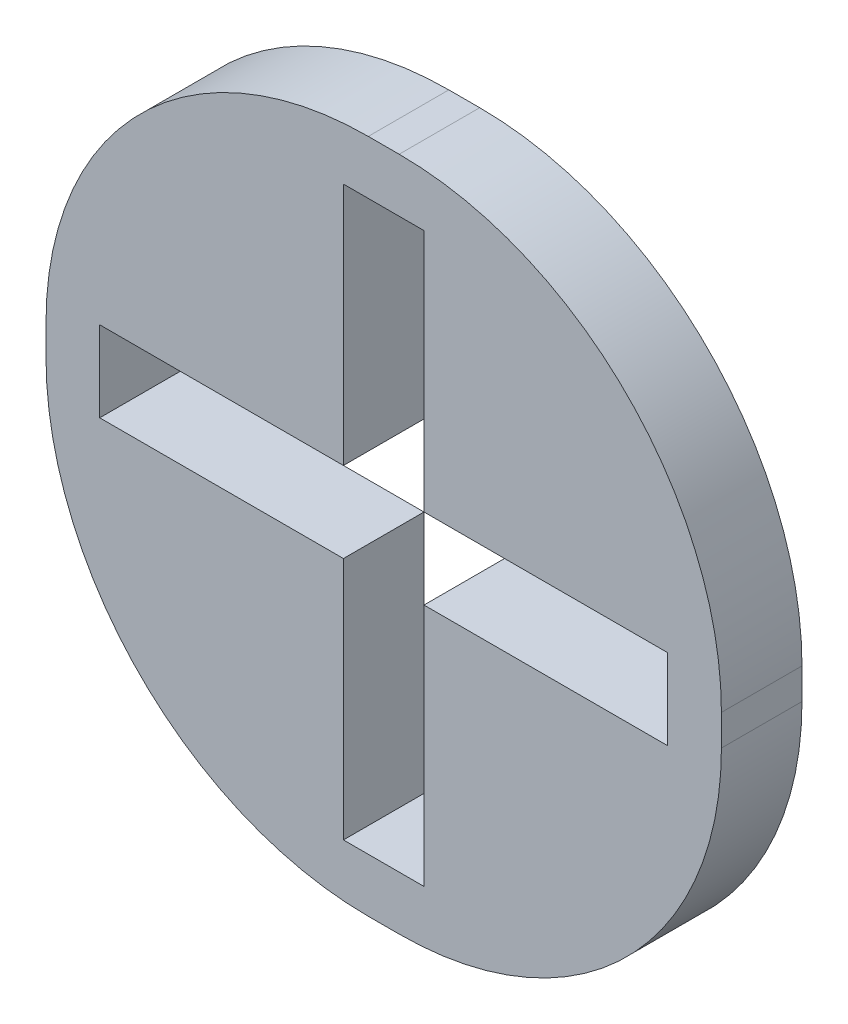
ISO-10303-21;
HEADER;
FILE_DESCRIPTION(('STEP AP214'),'2;1');
FILE_NAME('part.step','',(''),(''),'','','');
FILE_SCHEMA(('AUTOMOTIVE_DESIGN { 1 0 10303 214 1 1 1 1 }'));
ENDSEC;
DATA;
#1=APPLICATION_CONTEXT('core data for automotive mechanical design processes');
#2=APPLICATION_PROTOCOL_DEFINITION('international standard','automotive_design',2000,#1);
#3=PRODUCT_CONTEXT('',#1,'mechanical');
#4=PRODUCT('Part','Part','',(#3));
#5=PRODUCT_RELATED_PRODUCT_CATEGORY('part','',(#4));
#6=PRODUCT_DEFINITION_FORMATION('','',#4);
#7=PRODUCT_DEFINITION_CONTEXT('part definition',#1,'design');
#8=PRODUCT_DEFINITION('design','',#6,#7);
#9=PRODUCT_DEFINITION_SHAPE('','',#8);
#10=(LENGTH_UNIT() NAMED_UNIT(*) SI_UNIT(.MILLI.,.METRE.));
#11=(NAMED_UNIT(*) PLANE_ANGLE_UNIT() SI_UNIT($,.RADIAN.));
#12=(NAMED_UNIT(*) SI_UNIT($,.STERADIAN.) SOLID_ANGLE_UNIT());
#13=UNCERTAINTY_MEASURE_WITH_UNIT(LENGTH_MEASURE(1.E-05),#10,'distance_accuracy_value','');
#14=(GEOMETRIC_REPRESENTATION_CONTEXT(3) GLOBAL_UNCERTAINTY_ASSIGNED_CONTEXT((#13)) GLOBAL_UNIT_ASSIGNED_CONTEXT((#10,
#11,#12)) REPRESENTATION_CONTEXT('',''));
#15=CARTESIAN_POINT('',(0.,0.,0.));
#16=DIRECTION('',(0.,0.,1.));
#17=DIRECTION('',(1.,0.,0.));
#18=AXIS2_PLACEMENT_3D('',#15,#16,#17);
#19=CARTESIAN_POINT('',(0.,12.575,3.));
#20=DIRECTION('',(0.,-1.,0.));
#21=DIRECTION('',(0.,0.,-1.));
#22=AXIS2_PLACEMENT_3D('',#19,#20,#21);
#23=PLANE('',#22);
#24=DIRECTION('',(-1.,0.,0.));
#25=VECTOR('',#24,1.);
#26=CARTESIAN_POINT('',(0.,12.575,0.));
#27=LINE('',#26,#25);
#28=CARTESIAN_POINT('',(0.574999999999999,12.575,0.));
#29=VERTEX_POINT('',#28);
#30=CARTESIAN_POINT('',(-0.575000000000008,12.575,0.));
#31=VERTEX_POINT('',#30);
#32=EDGE_CURVE('E254',#29,#31,#27,.T.);
#33=ORIENTED_EDGE('',*,*,#32,.T.);
#34=DIRECTION('',(0.,0.,-1.));
#35=VECTOR('',#34,1.);
#36=CARTESIAN_POINT('',(-0.575000000000008,12.575,3.));
#37=LINE('',#36,#35);
#38=CARTESIAN_POINT('',(-0.575000000000008,12.575,3.));
#39=VERTEX_POINT('',#38);
#40=EDGE_CURVE('E11',#39,#31,#37,.T.);
#41=ORIENTED_EDGE('',*,*,#40,.F.);
#42=DIRECTION('',(-1.,0.,0.));
#43=VECTOR('',#42,1.);
#44=CARTESIAN_POINT('',(0.,12.575,3.));
#45=LINE('',#44,#43);
#46=CARTESIAN_POINT('',(0.574999999999999,12.575,3.));
#47=VERTEX_POINT('',#46);
#48=EDGE_CURVE('E405',#47,#39,#45,.T.);
#49=ORIENTED_EDGE('',*,*,#48,.F.);
#50=DIRECTION('',(0.,0.,-1.));
#51=VECTOR('',#50,1.);
#52=CARTESIAN_POINT('',(0.574999999999999,12.575,3.));
#53=LINE('',#52,#51);
#54=EDGE_CURVE('E281',#47,#29,#53,.T.);
#55=ORIENTED_EDGE('',*,*,#54,.T.);
#56=EDGE_LOOP('',(#33,#41,#49,#55));
#57=FACE_BOUND('',#56,.T.);
#58=ADVANCED_FACE('F45',(#57),#23,.F.);
#59=CARTESIAN_POINT('',(-0.575000000000004,0.575000000000001,3.));
#60=DIRECTION('',(0.,0.,-1.));
#61=DIRECTION('',(-1.,0.,0.));
#62=AXIS2_PLACEMENT_3D('',#59,#60,#61);
#63=CYLINDRICAL_SURFACE('',#62,12.);
#64=CARTESIAN_POINT('',(-0.575000000000004,0.575000000000001,0.));
#65=DIRECTION('',(0.,0.,1.));
#66=DIRECTION('',(1.,0.,0.));
#67=AXIS2_PLACEMENT_3D('',#64,#65,#66);
#68=CIRCLE('',#67,12.);
#69=CARTESIAN_POINT('',(-12.575,0.574999999999998,0.));
#70=VERTEX_POINT('',#69);
#71=EDGE_CURVE('E258',#31,#70,#68,.T.);
#72=ORIENTED_EDGE('',*,*,#71,.T.);
#73=DIRECTION('',(0.,0.,-1.));
#74=VECTOR('',#73,1.);
#75=CARTESIAN_POINT('',(-12.575,0.574999999999998,3.));
#76=LINE('',#75,#74);
#77=CARTESIAN_POINT('',(-12.575,0.574999999999998,3.));
#78=VERTEX_POINT('',#77);
#79=EDGE_CURVE('E56',#78,#70,#76,.T.);
#80=ORIENTED_EDGE('',*,*,#79,.F.);
#81=CARTESIAN_POINT('',(-0.575000000000004,0.575000000000001,3.));
#82=DIRECTION('',(0.,0.,1.));
#83=DIRECTION('',(1.,0.,0.));
#84=AXIS2_PLACEMENT_3D('',#81,#82,#83);
#85=CIRCLE('',#84,12.);
#86=EDGE_CURVE('E408',#39,#78,#85,.T.);
#87=ORIENTED_EDGE('',*,*,#86,.F.);
#88=ORIENTED_EDGE('',*,*,#40,.T.);
#89=EDGE_LOOP('',(#72,#80,#87,#88));
#90=FACE_BOUND('',#89,.T.);
#91=ADVANCED_FACE('F440',(#90),#63,.T.);
#92=CARTESIAN_POINT('',(-12.575,0.,3.));
#93=DIRECTION('',(-1.,0.,0.));
#94=DIRECTION('',(0.,0.,1.));
#95=AXIS2_PLACEMENT_3D('',#92,#93,#94);
#96=PLANE('',#95);
#97=DIRECTION('',(0.,1.,0.));
#98=VECTOR('',#97,1.);
#99=CARTESIAN_POINT('',(-12.575,0.,0.));
#100=LINE('',#99,#98);
#101=CARTESIAN_POINT('',(-12.575,-0.575000000000002,0.));
#102=VERTEX_POINT('',#101);
#103=EDGE_CURVE('E262',#102,#70,#100,.T.);
#104=ORIENTED_EDGE('',*,*,#103,.F.);
#105=DIRECTION('',(0.,0.,-1.));
#106=VECTOR('',#105,1.);
#107=CARTESIAN_POINT('',(-12.575,-0.575000000000002,3.));
#108=LINE('',#107,#106);
#109=CARTESIAN_POINT('',(-12.575,-0.575000000000002,3.));
#110=VERTEX_POINT('',#109);
#111=EDGE_CURVE('E291',#110,#102,#108,.T.);
#112=ORIENTED_EDGE('',*,*,#111,.F.);
#113=DIRECTION('',(0.,1.,0.));
#114=VECTOR('',#113,1.);
#115=CARTESIAN_POINT('',(-12.575,0.,3.));
#116=LINE('',#115,#114);
#117=EDGE_CURVE('E411',#110,#78,#116,.T.);
#118=ORIENTED_EDGE('',*,*,#117,.T.);
#119=ORIENTED_EDGE('',*,*,#79,.T.);
#120=EDGE_LOOP('',(#104,#112,#118,#119));
#121=FACE_BOUND('',#120,.T.);
#122=ADVANCED_FACE('F445',(#121),#96,.T.);
#123=CARTESIAN_POINT('',(-0.575000000000004,-0.574999999999999,3.));
#124=DIRECTION('',(0.,0.,-1.));
#125=DIRECTION('',(-1.,0.,0.));
#126=AXIS2_PLACEMENT_3D('',#123,#124,#125);
#127=CYLINDRICAL_SURFACE('',#126,12.);
#128=CARTESIAN_POINT('',(-0.575000000000004,-0.574999999999999,0.));
#129=DIRECTION('',(0.,0.,1.));
#130=DIRECTION('',(1.,0.,0.));
#131=AXIS2_PLACEMENT_3D('',#128,#129,#130);
#132=CIRCLE('',#131,12.);
#133=CARTESIAN_POINT('',(-0.574999999999999,-12.575,0.));
#134=VERTEX_POINT('',#133);
#135=EDGE_CURVE('E266',#134,#102,#132,.F.);
#136=ORIENTED_EDGE('',*,*,#135,.F.);
#137=DIRECTION('',(0.,0.,-1.));
#138=VECTOR('',#137,1.);
#139=CARTESIAN_POINT('',(-0.574999999999999,-12.575,3.));
#140=LINE('',#139,#138);
#141=CARTESIAN_POINT('',(-0.574999999999999,-12.575,3.));
#142=VERTEX_POINT('',#141);
#143=EDGE_CURVE('E288',#142,#134,#140,.T.);
#144=ORIENTED_EDGE('',*,*,#143,.F.);
#145=CARTESIAN_POINT('',(-0.575000000000004,-0.574999999999999,3.));
#146=DIRECTION('',(0.,0.,1.));
#147=DIRECTION('',(1.,0.,0.));
#148=AXIS2_PLACEMENT_3D('',#145,#146,#147);
#149=CIRCLE('',#148,12.);
#150=EDGE_CURVE('E415',#142,#110,#149,.F.);
#151=ORIENTED_EDGE('',*,*,#150,.T.);
#152=ORIENTED_EDGE('',*,*,#111,.T.);
#153=EDGE_LOOP('',(#136,#144,#151,#152));
#154=FACE_BOUND('',#153,.T.);
#155=ADVANCED_FACE('F608',(#154),#127,.T.);
#156=CARTESIAN_POINT('',(0.,-12.575,3.));
#157=DIRECTION('',(0.,-1.,0.));
#158=DIRECTION('',(0.,0.,-1.));
#159=AXIS2_PLACEMENT_3D('',#156,#157,#158);
#160=PLANE('',#159);
#161=DIRECTION('',(-1.,0.,0.));
#162=VECTOR('',#161,1.);
#163=CARTESIAN_POINT('',(0.,-12.575,0.));
#164=LINE('',#163,#162);
#165=CARTESIAN_POINT('',(0.574999999999999,-12.575,0.));
#166=VERTEX_POINT('',#165);
#167=EDGE_CURVE('E270',#166,#134,#164,.T.);
#168=ORIENTED_EDGE('',*,*,#167,.F.);
#169=DIRECTION('',(0.,0.,-1.));
#170=VECTOR('',#169,1.);
#171=CARTESIAN_POINT('',(0.574999999999999,-12.575,3.));
#172=LINE('',#171,#170);
#173=CARTESIAN_POINT('',(0.574999999999999,-12.575,3.));
#174=VERTEX_POINT('',#173);
#175=EDGE_CURVE('E212',#174,#166,#172,.T.);
#176=ORIENTED_EDGE('',*,*,#175,.F.);
#177=DIRECTION('',(-1.,0.,0.));
#178=VECTOR('',#177,1.);
#179=CARTESIAN_POINT('',(0.,-12.575,3.));
#180=LINE('',#179,#178);
#181=EDGE_CURVE('E203',#174,#142,#180,.T.);
#182=ORIENTED_EDGE('',*,*,#181,.T.);
#183=ORIENTED_EDGE('',*,*,#143,.T.);
#184=EDGE_LOOP('',(#168,#176,#182,#183));
#185=FACE_BOUND('',#184,.T.);
#186=ADVANCED_FACE('F421',(#185),#160,.T.);
#187=CARTESIAN_POINT('',(0.574999999999999,-0.574999999999999,3.));
#188=DIRECTION('',(0.,0.,-1.));
#189=DIRECTION('',(-1.,0.,0.));
#190=AXIS2_PLACEMENT_3D('',#187,#188,#189);
#191=CYLINDRICAL_SURFACE('',#190,12.);
#192=CARTESIAN_POINT('',(0.574999999999999,-0.574999999999999,0.));
#193=DIRECTION('',(0.,0.,1.));
#194=DIRECTION('',(1.,0.,0.));
#195=AXIS2_PLACEMENT_3D('',#192,#193,#194);
#196=CIRCLE('',#195,12.);
#197=CARTESIAN_POINT('',(12.575,-0.574999999999998,0.));
#198=VERTEX_POINT('',#197);
#199=EDGE_CURVE('E210',#166,#198,#196,.T.);
#200=ORIENTED_EDGE('',*,*,#199,.T.);
#201=DIRECTION('',(0.,0.,-1.));
#202=VECTOR('',#201,1.);
#203=CARTESIAN_POINT('',(12.575,-0.574999999999998,3.));
#204=LINE('',#203,#202);
#205=CARTESIAN_POINT('',(12.575,-0.574999999999998,3.));
#206=VERTEX_POINT('',#205);
#207=EDGE_CURVE('E207',#206,#198,#204,.T.);
#208=ORIENTED_EDGE('',*,*,#207,.F.);
#209=CARTESIAN_POINT('',(0.574999999999999,-0.574999999999999,3.));
#210=DIRECTION('',(0.,0.,1.));
#211=DIRECTION('',(1.,0.,0.));
#212=AXIS2_PLACEMENT_3D('',#209,#210,#211);
#213=CIRCLE('',#212,12.);
#214=EDGE_CURVE('E196',#174,#206,#213,.T.);
#215=ORIENTED_EDGE('',*,*,#214,.F.);
#216=ORIENTED_EDGE('',*,*,#175,.T.);
#217=EDGE_LOOP('',(#200,#208,#215,#216));
#218=FACE_BOUND('',#217,.T.);
#219=ADVANCED_FACE('F208',(#218),#191,.T.);
#220=CARTESIAN_POINT('',(12.575,0.,3.));
#221=DIRECTION('',(-1.,0.,0.));
#222=DIRECTION('',(0.,0.,1.));
#223=AXIS2_PLACEMENT_3D('',#220,#221,#222);
#224=PLANE('',#223);
#225=DIRECTION('',(0.,1.,0.));
#226=VECTOR('',#225,1.);
#227=CARTESIAN_POINT('',(12.575,0.,0.));
#228=LINE('',#227,#226);
#229=CARTESIAN_POINT('',(12.575,0.575000000000002,0.));
#230=VERTEX_POINT('',#229);
#231=EDGE_CURVE('E130',#198,#230,#228,.T.);
#232=ORIENTED_EDGE('',*,*,#231,.T.);
#233=DIRECTION('',(0.,0.,-1.));
#234=VECTOR('',#233,1.);
#235=CARTESIAN_POINT('',(12.575,0.575000000000002,3.));
#236=LINE('',#235,#234);
#237=CARTESIAN_POINT('',(12.575,0.575000000000002,3.));
#238=VERTEX_POINT('',#237);
#239=EDGE_CURVE('E213',#238,#230,#236,.T.);
#240=ORIENTED_EDGE('',*,*,#239,.F.);
#241=DIRECTION('',(0.,1.,0.));
#242=VECTOR('',#241,1.);
#243=CARTESIAN_POINT('',(12.575,0.,3.));
#244=LINE('',#243,#242);
#245=EDGE_CURVE('E200',#206,#238,#244,.T.);
#246=ORIENTED_EDGE('',*,*,#245,.F.);
#247=ORIENTED_EDGE('',*,*,#207,.T.);
#248=EDGE_LOOP('',(#232,#240,#246,#247));
#249=FACE_BOUND('',#248,.T.);
#250=ADVANCED_FACE('F215',(#249),#224,.F.);
#251=CARTESIAN_POINT('',(0.,10.575,3.));
#252=DIRECTION('',(0.,1.,0.));
#253=DIRECTION('',(0.,0.,1.));
#254=AXIS2_PLACEMENT_3D('',#251,#252,#253);
#255=PLANE('',#254);
#256=DIRECTION('',(1.,0.,0.));
#257=VECTOR('',#256,1.);
#258=CARTESIAN_POINT('',(0.,10.575,0.));
#259=LINE('',#258,#257);
#260=CARTESIAN_POINT('',(-1.5,10.575,0.));
#261=VERTEX_POINT('',#260);
#262=CARTESIAN_POINT('',(1.5,10.575,0.));
#263=VERTEX_POINT('',#262);
#264=EDGE_CURVE('E223',#261,#263,#259,.T.);
#265=ORIENTED_EDGE('',*,*,#264,.T.);
#266=DIRECTION('',(0.,0.,-1.));
#267=VECTOR('',#266,1.);
#268=CARTESIAN_POINT('',(1.5,10.575,3.));
#269=LINE('',#268,#267);
#270=CARTESIAN_POINT('',(1.5,10.575,3.));
#271=VERTEX_POINT('',#270);
#272=EDGE_CURVE('E49',#271,#263,#269,.T.);
#273=ORIENTED_EDGE('',*,*,#272,.F.);
#274=DIRECTION('',(1.,0.,0.));
#275=VECTOR('',#274,1.);
#276=CARTESIAN_POINT('',(0.,10.575,3.));
#277=LINE('',#276,#275);
#278=CARTESIAN_POINT('',(-1.5,10.575,3.));
#279=VERTEX_POINT('',#278);
#280=EDGE_CURVE('E280',#279,#271,#277,.T.);
#281=ORIENTED_EDGE('',*,*,#280,.F.);
#282=DIRECTION('',(0.,0.,-1.));
#283=VECTOR('',#282,1.);
#284=CARTESIAN_POINT('',(-1.5,10.575,3.));
#285=LINE('',#284,#283);
#286=EDGE_CURVE('E219',#279,#261,#285,.T.);
#287=ORIENTED_EDGE('',*,*,#286,.T.);
#288=EDGE_LOOP('',(#265,#273,#281,#287));
#289=FACE_BOUND('',#288,.T.);
#290=ADVANCED_FACE('F47',(#289),#255,.F.);
#291=CARTESIAN_POINT('',(1.5,0.,3.));
#292=DIRECTION('',(1.,0.,0.));
#293=DIRECTION('',(0.,0.,-1.));
#294=AXIS2_PLACEMENT_3D('',#291,#292,#293);
#295=PLANE('',#294);
#296=DIRECTION('',(0.,-1.,0.));
#297=VECTOR('',#296,1.);
#298=CARTESIAN_POINT('',(1.5,0.,0.));
#299=LINE('',#298,#297);
#300=CARTESIAN_POINT('',(1.5,1.5,0.));
#301=VERTEX_POINT('',#300);
#302=EDGE_CURVE('E227',#263,#301,#299,.T.);
#303=ORIENTED_EDGE('',*,*,#302,.T.);
#304=DIRECTION('',(0.,0.,-1.));
#305=VECTOR('',#304,1.);
#306=CARTESIAN_POINT('',(1.5,1.5,3.));
#307=LINE('',#306,#305);
#308=CARTESIAN_POINT('',(1.5,1.5,3.));
#309=VERTEX_POINT('',#308);
#310=EDGE_CURVE('E329',#309,#301,#307,.T.);
#311=ORIENTED_EDGE('',*,*,#310,.F.);
#312=DIRECTION('',(0.,-1.,0.));
#313=VECTOR('',#312,1.);
#314=CARTESIAN_POINT('',(1.5,0.,3.));
#315=LINE('',#314,#313);
#316=EDGE_CURVE('E145',#271,#309,#315,.T.);
#317=ORIENTED_EDGE('',*,*,#316,.F.);
#318=ORIENTED_EDGE('',*,*,#272,.T.);
#319=EDGE_LOOP('',(#303,#311,#317,#318));
#320=FACE_BOUND('',#319,.T.);
#321=ADVANCED_FACE('F337',(#320),#295,.F.);
#322=CARTESIAN_POINT('',(0.,1.5,3.));
#323=DIRECTION('',(0.,1.,0.));
#324=DIRECTION('',(0.,0.,1.));
#325=AXIS2_PLACEMENT_3D('',#322,#323,#324);
#326=PLANE('',#325);
#327=DIRECTION('',(1.,0.,0.));
#328=VECTOR('',#327,1.);
#329=CARTESIAN_POINT('',(0.,1.5,0.));
#330=LINE('',#329,#328);
#331=CARTESIAN_POINT('',(10.575,1.5,0.));
#332=VERTEX_POINT('',#331);
#333=EDGE_CURVE('E230',#301,#332,#330,.T.);
#334=ORIENTED_EDGE('',*,*,#333,.T.);
#335=DIRECTION('',(0.,0.,-1.));
#336=VECTOR('',#335,1.);
#337=CARTESIAN_POINT('',(10.575,1.5,3.));
#338=LINE('',#337,#336);
#339=CARTESIAN_POINT('',(10.575,1.5,3.));
#340=VERTEX_POINT('',#339);
#341=EDGE_CURVE('E326',#340,#332,#338,.T.);
#342=ORIENTED_EDGE('',*,*,#341,.F.);
#343=DIRECTION('',(1.,0.,0.));
#344=VECTOR('',#343,1.);
#345=CARTESIAN_POINT('',(0.,1.5,3.));
#346=LINE('',#345,#344);
#347=EDGE_CURVE('E477',#309,#340,#346,.T.);
#348=ORIENTED_EDGE('',*,*,#347,.F.);
#349=ORIENTED_EDGE('',*,*,#310,.T.);
#350=EDGE_LOOP('',(#334,#342,#348,#349));
#351=FACE_BOUND('',#350,.T.);
#352=ADVANCED_FACE('F452',(#351),#326,.F.);
#353=CARTESIAN_POINT('',(10.575,0.,3.));
#354=DIRECTION('',(1.,0.,0.));
#355=DIRECTION('',(0.,1.,0.));
#356=AXIS2_PLACEMENT_3D('',#353,#354,#355);
#357=PLANE('',#356);
#358=DIRECTION('',(0.,-1.,0.));
#359=VECTOR('',#358,1.);
#360=CARTESIAN_POINT('',(10.575,0.,0.));
#361=LINE('',#360,#359);
#362=CARTESIAN_POINT('',(10.575,-1.5,0.));
#363=VERTEX_POINT('',#362);
#364=EDGE_CURVE('E234',#332,#363,#361,.T.);
#365=ORIENTED_EDGE('',*,*,#364,.T.);
#366=DIRECTION('',(0.,0.,-1.));
#367=VECTOR('',#366,1.);
#368=CARTESIAN_POINT('',(10.575,-1.5,3.));
#369=LINE('',#368,#367);
#370=CARTESIAN_POINT('',(10.575,-1.5,3.));
#371=VERTEX_POINT('',#370);
#372=EDGE_CURVE('E322',#371,#363,#369,.T.);
#373=ORIENTED_EDGE('',*,*,#372,.F.);
#374=DIRECTION('',(0.,-1.,0.));
#375=VECTOR('',#374,1.);
#376=CARTESIAN_POINT('',(10.575,0.,3.));
#377=LINE('',#376,#375);
#378=EDGE_CURVE('E475',#340,#371,#377,.T.);
#379=ORIENTED_EDGE('',*,*,#378,.F.);
#380=ORIENTED_EDGE('',*,*,#341,.T.);
#381=EDGE_LOOP('',(#365,#373,#379,#380));
#382=FACE_BOUND('',#381,.T.);
#383=ADVANCED_FACE('F461',(#382),#357,.F.);
#384=CARTESIAN_POINT('',(0.,-1.5,3.));
#385=DIRECTION('',(0.,-1.,0.));
#386=DIRECTION('',(0.,0.,-1.));
#387=AXIS2_PLACEMENT_3D('',#384,#385,#386);
#388=PLANE('',#387);
#389=DIRECTION('',(-1.,0.,0.));
#390=VECTOR('',#389,1.);
#391=CARTESIAN_POINT('',(0.,-1.5,0.));
#392=LINE('',#391,#390);
#393=CARTESIAN_POINT('',(1.5,-1.5,0.));
#394=VERTEX_POINT('',#393);
#395=EDGE_CURVE('E238',#363,#394,#392,.T.);
#396=ORIENTED_EDGE('',*,*,#395,.T.);
#397=DIRECTION('',(0.,0.,-1.));
#398=VECTOR('',#397,1.);
#399=CARTESIAN_POINT('',(1.5,-1.5,3.));
#400=LINE('',#399,#398);
#401=CARTESIAN_POINT('',(1.5,-1.5,3.));
#402=VERTEX_POINT('',#401);
#403=EDGE_CURVE('E318',#402,#394,#400,.T.);
#404=ORIENTED_EDGE('',*,*,#403,.F.);
#405=DIRECTION('',(-1.,0.,0.));
#406=VECTOR('',#405,1.);
#407=CARTESIAN_POINT('',(0.,-1.5,3.));
#408=LINE('',#407,#406);
#409=EDGE_CURVE('E397',#371,#402,#408,.T.);
#410=ORIENTED_EDGE('',*,*,#409,.F.);
#411=ORIENTED_EDGE('',*,*,#372,.T.);
#412=EDGE_LOOP('',(#396,#404,#410,#411));
#413=FACE_BOUND('',#412,.T.);
#414=ADVANCED_FACE('F457',(#413),#388,.F.);
#415=CARTESIAN_POINT('',(1.5,-10.575,0.));
#416=VERTEX_POINT('',#415);
#417=EDGE_CURVE('E231',#394,#416,#299,.T.);
#418=ORIENTED_EDGE('',*,*,#417,.T.);
#419=DIRECTION('',(0.,0.,-1.));
#420=VECTOR('',#419,1.);
#421=CARTESIAN_POINT('',(1.5,-10.575,3.));
#422=LINE('',#421,#420);
#423=CARTESIAN_POINT('',(1.5,-10.575,3.));
#424=VERTEX_POINT('',#423);
#425=EDGE_CURVE('E315',#424,#416,#422,.T.);
#426=ORIENTED_EDGE('',*,*,#425,.F.);
#427=EDGE_CURVE('E391',#402,#424,#315,.T.);
#428=ORIENTED_EDGE('',*,*,#427,.F.);
#429=ORIENTED_EDGE('',*,*,#403,.T.);
#430=EDGE_LOOP('',(#418,#426,#428,#429));
#431=FACE_BOUND('',#430,.T.);
#432=ADVANCED_FACE('F377',(#431),#295,.F.);
#433=CARTESIAN_POINT('',(0.,-10.575,3.));
#434=DIRECTION('',(0.,1.,0.));
#435=DIRECTION('',(0.,0.,1.));
#436=AXIS2_PLACEMENT_3D('',#433,#434,#435);
#437=PLANE('',#436);
#438=DIRECTION('',(1.,0.,0.));
#439=VECTOR('',#438,1.);
#440=CARTESIAN_POINT('',(0.,-10.575,0.));
#441=LINE('',#440,#439);
#442=CARTESIAN_POINT('',(-1.5,-10.575,0.));
#443=VERTEX_POINT('',#442);
#444=EDGE_CURVE('E242',#443,#416,#441,.T.);
#445=ORIENTED_EDGE('',*,*,#444,.F.);
#446=DIRECTION('',(0.,0.,-1.));
#447=VECTOR('',#446,1.);
#448=CARTESIAN_POINT('',(-1.5,-10.575,3.));
#449=LINE('',#448,#447);
#450=CARTESIAN_POINT('',(-1.5,-10.575,3.));
#451=VERTEX_POINT('',#450);
#452=EDGE_CURVE('E312',#451,#443,#449,.T.);
#453=ORIENTED_EDGE('',*,*,#452,.F.);
#454=DIRECTION('',(1.,0.,0.));
#455=VECTOR('',#454,1.);
#456=CARTESIAN_POINT('',(0.,-10.575,3.));
#457=LINE('',#456,#455);
#458=EDGE_CURVE('E386',#451,#424,#457,.T.);
#459=ORIENTED_EDGE('',*,*,#458,.T.);
#460=ORIENTED_EDGE('',*,*,#425,.T.);
#461=EDGE_LOOP('',(#445,#453,#459,#460));
#462=FACE_BOUND('',#461,.T.);
#463=ADVANCED_FACE('F384',(#462),#437,.T.);
#464=CARTESIAN_POINT('',(-1.5,0.,3.));
#465=DIRECTION('',(1.,0.,0.));
#466=DIRECTION('',(0.,0.,-1.));
#467=AXIS2_PLACEMENT_3D('',#464,#465,#466);
#468=PLANE('',#467);
#469=DIRECTION('',(0.,-1.,0.));
#470=VECTOR('',#469,1.);
#471=CARTESIAN_POINT('',(-1.5,0.,0.));
#472=LINE('',#471,#470);
#473=CARTESIAN_POINT('',(-1.5,-1.5,0.));
#474=VERTEX_POINT('',#473);
#475=EDGE_CURVE('E246',#474,#443,#472,.T.);
#476=ORIENTED_EDGE('',*,*,#475,.F.);
#477=DIRECTION('',(0.,0.,-1.));
#478=VECTOR('',#477,1.);
#479=CARTESIAN_POINT('',(-1.5,-1.5,3.));
#480=LINE('',#479,#478);
#481=CARTESIAN_POINT('',(-1.5,-1.5,3.));
#482=VERTEX_POINT('',#481);
#483=EDGE_CURVE('E309',#482,#474,#480,.T.);
#484=ORIENTED_EDGE('',*,*,#483,.F.);
#485=DIRECTION('',(0.,-1.,0.));
#486=VECTOR('',#485,1.);
#487=CARTESIAN_POINT('',(-1.5,0.,3.));
#488=LINE('',#487,#486);
#489=EDGE_CURVE('E390',#482,#451,#488,.T.);
#490=ORIENTED_EDGE('',*,*,#489,.T.);
#491=ORIENTED_EDGE('',*,*,#452,.T.);
#492=EDGE_LOOP('',(#476,#484,#490,#491));
#493=FACE_BOUND('',#492,.T.);
#494=ADVANCED_FACE('F436',(#493),#468,.T.);
#495=CARTESIAN_POINT('',(-10.575,-1.5,0.));
#496=VERTEX_POINT('',#495);
#497=EDGE_CURVE('E241',#474,#496,#392,.T.);
#498=ORIENTED_EDGE('',*,*,#497,.T.);
#499=DIRECTION('',(0.,0.,-1.));
#500=VECTOR('',#499,1.);
#501=CARTESIAN_POINT('',(-10.575,-1.5,3.));
#502=LINE('',#501,#500);
#503=CARTESIAN_POINT('',(-10.575,-1.5,3.));
#504=VERTEX_POINT('',#503);
#505=EDGE_CURVE('E305',#504,#496,#502,.T.);
#506=ORIENTED_EDGE('',*,*,#505,.F.);
#507=EDGE_CURVE('E369',#482,#504,#408,.T.);
#508=ORIENTED_EDGE('',*,*,#507,.F.);
#509=ORIENTED_EDGE('',*,*,#483,.T.);
#510=EDGE_LOOP('',(#498,#506,#508,#509));
#511=FACE_BOUND('',#510,.T.);
#512=ADVANCED_FACE('F368',(#511),#388,.F.);
#513=CARTESIAN_POINT('',(-10.575,0.,3.));
#514=DIRECTION('',(-1.,0.,0.));
#515=DIRECTION('',(0.,-1.,0.));
#516=AXIS2_PLACEMENT_3D('',#513,#514,#515);
#517=PLANE('',#516);
#518=DIRECTION('',(0.,1.,0.));
#519=VECTOR('',#518,1.);
#520=CARTESIAN_POINT('',(-10.575,0.,0.));
#521=LINE('',#520,#519);
#522=CARTESIAN_POINT('',(-10.575,1.5,0.));
#523=VERTEX_POINT('',#522);
#524=EDGE_CURVE('E251',#496,#523,#521,.T.);
#525=ORIENTED_EDGE('',*,*,#524,.T.);
#526=DIRECTION('',(0.,0.,-1.));
#527=VECTOR('',#526,1.);
#528=CARTESIAN_POINT('',(-10.575,1.5,3.));
#529=LINE('',#528,#527);
#530=CARTESIAN_POINT('',(-10.575,1.5,3.));
#531=VERTEX_POINT('',#530);
#532=EDGE_CURVE('E301',#531,#523,#529,.T.);
#533=ORIENTED_EDGE('',*,*,#532,.F.);
#534=DIRECTION('',(0.,1.,0.));
#535=VECTOR('',#534,1.);
#536=CARTESIAN_POINT('',(-10.575,0.,3.));
#537=LINE('',#536,#535);
#538=EDGE_CURVE('E365',#504,#531,#537,.T.);
#539=ORIENTED_EDGE('',*,*,#538,.F.);
#540=ORIENTED_EDGE('',*,*,#505,.T.);
#541=EDGE_LOOP('',(#525,#533,#539,#540));
#542=FACE_BOUND('',#541,.T.);
#543=ADVANCED_FACE('F362',(#542),#517,.F.);
#544=CARTESIAN_POINT('',(-1.5,1.5,0.));
#545=VERTEX_POINT('',#544);
#546=EDGE_CURVE('E235',#523,#545,#330,.T.);
#547=ORIENTED_EDGE('',*,*,#546,.T.);
#548=DIRECTION('',(0.,0.,-1.));
#549=VECTOR('',#548,1.);
#550=CARTESIAN_POINT('',(-1.5,1.5,3.));
#551=LINE('',#550,#549);
#552=CARTESIAN_POINT('',(-1.5,1.5,3.));
#553=VERTEX_POINT('',#552);
#554=EDGE_CURVE('E298',#553,#545,#551,.T.);
#555=ORIENTED_EDGE('',*,*,#554,.F.);
#556=EDGE_CURVE('E404',#531,#553,#346,.T.);
#557=ORIENTED_EDGE('',*,*,#556,.F.);
#558=ORIENTED_EDGE('',*,*,#532,.T.);
#559=EDGE_LOOP('',(#547,#555,#557,#558));
#560=FACE_BOUND('',#559,.T.);
#561=ADVANCED_FACE('F355',(#560),#326,.F.);
#562=EDGE_CURVE('E250',#261,#545,#472,.T.);
#563=ORIENTED_EDGE('',*,*,#562,.F.);
#564=ORIENTED_EDGE('',*,*,#286,.F.);
#565=EDGE_CURVE('E396',#279,#553,#488,.T.);
#566=ORIENTED_EDGE('',*,*,#565,.T.);
#567=ORIENTED_EDGE('',*,*,#554,.T.);
#568=EDGE_LOOP('',(#563,#564,#566,#567));
#569=FACE_BOUND('',#568,.T.);
#570=ADVANCED_FACE('F348',(#569),#468,.T.);
#571=CARTESIAN_POINT('',(0.574999999999999,0.575000000000001,3.));
#572=DIRECTION('',(0.,0.,-1.));
#573=DIRECTION('',(-1.,0.,0.));
#574=AXIS2_PLACEMENT_3D('',#571,#572,#573);
#575=CYLINDRICAL_SURFACE('',#574,12.);
#576=CARTESIAN_POINT('',(0.574999999999999,0.575000000000001,0.));
#577=DIRECTION('',(0.,0.,1.));
#578=DIRECTION('',(1.,0.,0.));
#579=AXIS2_PLACEMENT_3D('',#576,#577,#578);
#580=CIRCLE('',#579,12.);
#581=EDGE_CURVE('E136',#230,#29,#580,.T.);
#582=ORIENTED_EDGE('',*,*,#581,.T.);
#583=ORIENTED_EDGE('',*,*,#54,.F.);
#584=CARTESIAN_POINT('',(0.574999999999999,0.575000000000001,3.));
#585=DIRECTION('',(0.,0.,1.));
#586=DIRECTION('',(1.,0.,0.));
#587=AXIS2_PLACEMENT_3D('',#584,#585,#586);
#588=CIRCLE('',#587,12.);
#589=EDGE_CURVE('E65',#238,#47,#588,.T.);
#590=ORIENTED_EDGE('',*,*,#589,.F.);
#591=ORIENTED_EDGE('',*,*,#239,.T.);
#592=EDGE_LOOP('',(#582,#583,#590,#591));
#593=FACE_BOUND('',#592,.T.);
#594=ADVANCED_FACE('F427',(#593),#575,.T.);
#595=CARTESIAN_POINT('',(0.,0.,3.));
#596=DIRECTION('',(0.,0.,1.));
#597=DIRECTION('',(1.,0.,0.));
#598=AXIS2_PLACEMENT_3D('',#595,#596,#597);
#599=PLANE('',#598);
#600=ORIENTED_EDGE('',*,*,#280,.T.);
#601=ORIENTED_EDGE('',*,*,#316,.T.);
#602=ORIENTED_EDGE('',*,*,#347,.T.);
#603=ORIENTED_EDGE('',*,*,#378,.T.);
#604=ORIENTED_EDGE('',*,*,#409,.T.);
#605=ORIENTED_EDGE('',*,*,#427,.T.);
#606=ORIENTED_EDGE('',*,*,#458,.F.);
#607=ORIENTED_EDGE('',*,*,#489,.F.);
#608=ORIENTED_EDGE('',*,*,#507,.T.);
#609=ORIENTED_EDGE('',*,*,#538,.T.);
#610=ORIENTED_EDGE('',*,*,#556,.T.);
#611=ORIENTED_EDGE('',*,*,#565,.F.);
#612=EDGE_LOOP('',(#600,#601,#602,#603,#604,#605,#606,#607,#608,#609,#610,#611));
#613=FACE_BOUND('',#612,.T.);
#614=ORIENTED_EDGE('',*,*,#48,.T.);
#615=ORIENTED_EDGE('',*,*,#86,.T.);
#616=ORIENTED_EDGE('',*,*,#117,.F.);
#617=ORIENTED_EDGE('',*,*,#150,.F.);
#618=ORIENTED_EDGE('',*,*,#181,.F.);
#619=ORIENTED_EDGE('',*,*,#214,.T.);
#620=ORIENTED_EDGE('',*,*,#245,.T.);
#621=ORIENTED_EDGE('',*,*,#589,.T.);
#622=EDGE_LOOP('',(#614,#615,#616,#617,#618,#619,#620,#621));
#623=FACE_BOUND('',#622,.T.);
#624=ADVANCED_FACE('F198',(#613,#623),#599,.T.);
#625=CARTESIAN_POINT('',(0.,0.,0.));
#626=DIRECTION('',(0.,0.,1.));
#627=DIRECTION('',(1.,0.,0.));
#628=AXIS2_PLACEMENT_3D('',#625,#626,#627);
#629=PLANE('',#628);
#630=ORIENTED_EDGE('',*,*,#264,.F.);
#631=ORIENTED_EDGE('',*,*,#562,.T.);
#632=ORIENTED_EDGE('',*,*,#546,.F.);
#633=ORIENTED_EDGE('',*,*,#524,.F.);
#634=ORIENTED_EDGE('',*,*,#497,.F.);
#635=ORIENTED_EDGE('',*,*,#475,.T.);
#636=ORIENTED_EDGE('',*,*,#444,.T.);
#637=ORIENTED_EDGE('',*,*,#417,.F.);
#638=ORIENTED_EDGE('',*,*,#395,.F.);
#639=ORIENTED_EDGE('',*,*,#364,.F.);
#640=ORIENTED_EDGE('',*,*,#333,.F.);
#641=ORIENTED_EDGE('',*,*,#302,.F.);
#642=EDGE_LOOP('',(#630,#631,#632,#633,#634,#635,#636,#637,#638,#639,#640,#641));
#643=FACE_BOUND('',#642,.T.);
#644=ORIENTED_EDGE('',*,*,#32,.F.);
#645=ORIENTED_EDGE('',*,*,#581,.F.);
#646=ORIENTED_EDGE('',*,*,#231,.F.);
#647=ORIENTED_EDGE('',*,*,#199,.F.);
#648=ORIENTED_EDGE('',*,*,#167,.T.);
#649=ORIENTED_EDGE('',*,*,#135,.T.);
#650=ORIENTED_EDGE('',*,*,#103,.T.);
#651=ORIENTED_EDGE('',*,*,#71,.F.);
#652=EDGE_LOOP('',(#644,#645,#646,#647,#648,#649,#650,#651));
#653=FACE_BOUND('',#652,.T.);
#654=ADVANCED_FACE('F344',(#643,#653),#629,.F.);
#655=CLOSED_SHELL('',(#58,#91,#122,#155,#186,#219,#250,#290,#321,#352,#383,#414,#432,#463,#494,
#512,#543,#561,#570,#594,#624,#654));
#656=MANIFOLD_SOLID_BREP('B2',#655);
#657=ADVANCED_BREP_SHAPE_REPRESENTATION('',(#18,#656),#14);
#658=SHAPE_DEFINITION_REPRESENTATION(#9,#657);
ENDSEC;
END-ISO-10303-21;
